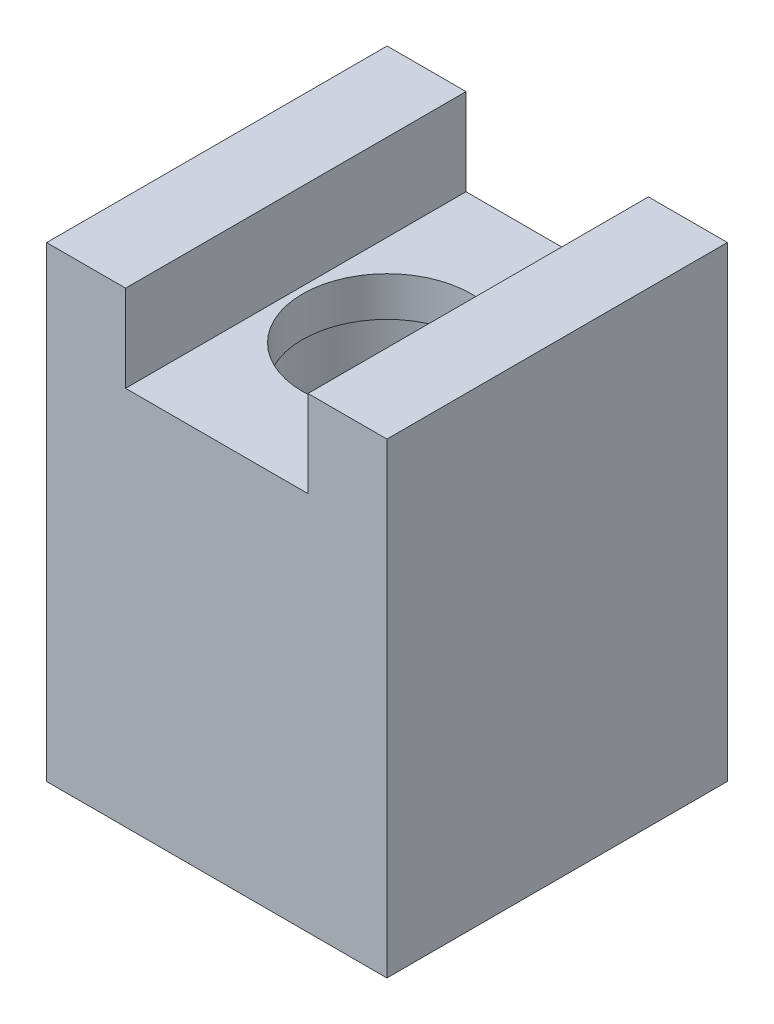
ISO-10303-21;
HEADER;
FILE_DESCRIPTION(('STEP AP214'),'2;1');
FILE_NAME('part.step','',(''),(''),'','','');
FILE_SCHEMA(('AUTOMOTIVE_DESIGN { 1 0 10303 214 1 1 1 1 }'));
ENDSEC;
DATA;
#1=APPLICATION_CONTEXT('core data for automotive mechanical design processes');
#2=APPLICATION_PROTOCOL_DEFINITION('international standard','automotive_design',2000,#1);
#3=PRODUCT_CONTEXT('',#1,'mechanical');
#4=PRODUCT('Part','Part','',(#3));
#5=PRODUCT_RELATED_PRODUCT_CATEGORY('part','',(#4));
#6=PRODUCT_DEFINITION_FORMATION('','',#4);
#7=PRODUCT_DEFINITION_CONTEXT('part definition',#1,'design');
#8=PRODUCT_DEFINITION('design','',#6,#7);
#9=PRODUCT_DEFINITION_SHAPE('','',#8);
#10=(LENGTH_UNIT() NAMED_UNIT(*) SI_UNIT(.MILLI.,.METRE.));
#11=(NAMED_UNIT(*) PLANE_ANGLE_UNIT() SI_UNIT($,.RADIAN.));
#12=(NAMED_UNIT(*) SI_UNIT($,.STERADIAN.) SOLID_ANGLE_UNIT());
#13=UNCERTAINTY_MEASURE_WITH_UNIT(LENGTH_MEASURE(1.E-05),#10,'distance_accuracy_value','');
#14=(GEOMETRIC_REPRESENTATION_CONTEXT(3) GLOBAL_UNCERTAINTY_ASSIGNED_CONTEXT((#13)) GLOBAL_UNIT_ASSIGNED_CONTEXT((#10,
#11,#12)) REPRESENTATION_CONTEXT('',''));
#15=CARTESIAN_POINT('',(0.,0.,0.));
#16=DIRECTION('',(0.,0.,1.));
#17=DIRECTION('',(1.,0.,0.));
#18=AXIS2_PLACEMENT_3D('',#15,#16,#17);
#19=CARTESIAN_POINT('',(0.,36.539424,0.));
#20=DIRECTION('',(0.,-1.,0.));
#21=DIRECTION('',(0.,0.,-1.));
#22=AXIS2_PLACEMENT_3D('',#19,#20,#21);
#23=CYLINDRICAL_SURFACE('',#22,7.5565);
#24=CARTESIAN_POINT('',(0.,33.9852,0.));
#25=DIRECTION('',(0.,-1.,0.));
#26=DIRECTION('',(0.,0.,-1.));
#27=AXIS2_PLACEMENT_3D('',#24,#25,#26);
#28=CIRCLE('',#27,7.5565);
#29=CARTESIAN_POINT('',(0.,33.9852,-7.5565));
#30=VERTEX_POINT('',#29);
#31=EDGE_CURVE('E189',#30,#30,#28,.F.);
#32=ORIENTED_EDGE('',*,*,#31,.T.);
#33=EDGE_LOOP('',(#32));
#34=FACE_BOUND('',#33,.T.);
#35=CARTESIAN_POINT('',(0.,30.44952,0.));
#36=DIRECTION('',(0.,-1.,0.));
#37=DIRECTION('',(0.,0.,-1.));
#38=AXIS2_PLACEMENT_3D('',#35,#36,#37);
#39=CIRCLE('',#38,7.5565);
#40=CARTESIAN_POINT('',(0.,30.44952,-7.5565));
#41=VERTEX_POINT('',#40);
#42=EDGE_CURVE('E36',#41,#41,#39,.F.);
#43=ORIENTED_EDGE('',*,*,#42,.F.);
#44=EDGE_LOOP('',(#43));
#45=FACE_BOUND('',#44,.T.);
#46=ADVANCED_FACE('F32',(#34,#45),#23,.F.);
#47=CARTESIAN_POINT('',(0.,41.74236,0.));
#48=DIRECTION('',(0.,-1.,0.));
#49=DIRECTION('',(0.,0.,-1.));
#50=AXIS2_PLACEMENT_3D('',#47,#48,#49);
#51=PLANE('',#50);
#52=DIRECTION('',(-1.,0.,0.));
#53=VECTOR('',#52,1.);
#54=CARTESIAN_POINT('',(-15.21714,41.74236,-15.22476));
#55=LINE('',#54,#53);
#56=CARTESIAN_POINT('',(15.21714,41.74236,-15.22476));
#57=VERTEX_POINT('',#56);
#58=CARTESIAN_POINT('',(8.15594,41.74236,-15.22476));
#59=VERTEX_POINT('',#58);
#60=EDGE_CURVE('E87',#57,#59,#55,.T.);
#61=ORIENTED_EDGE('',*,*,#60,.T.);
#62=DIRECTION('',(0.,0.,-1.));
#63=VECTOR('',#62,1.);
#64=CARTESIAN_POINT('',(8.15594,41.74236,15.22476));
#65=LINE('',#64,#63);
#66=CARTESIAN_POINT('',(8.15594,41.74236,15.22476));
#67=VERTEX_POINT('',#66);
#68=EDGE_CURVE('E184',#67,#59,#65,.T.);
#69=ORIENTED_EDGE('',*,*,#68,.F.);
#70=DIRECTION('',(1.,0.,0.));
#71=VECTOR('',#70,1.);
#72=CARTESIAN_POINT('',(-15.21714,41.74236,15.22476));
#73=LINE('',#72,#71);
#74=CARTESIAN_POINT('',(15.21714,41.74236,15.22476));
#75=VERTEX_POINT('',#74);
#76=EDGE_CURVE('E58',#67,#75,#73,.T.);
#77=ORIENTED_EDGE('',*,*,#76,.T.);
#78=DIRECTION('',(0.,0.,-1.));
#79=VECTOR('',#78,1.);
#80=CARTESIAN_POINT('',(15.21714,41.74236,15.22476));
#81=LINE('',#80,#79);
#82=EDGE_CURVE('E195',#75,#57,#81,.T.);
#83=ORIENTED_EDGE('',*,*,#82,.T.);
#84=EDGE_LOOP('',(#61,#69,#77,#83));
#85=FACE_BOUND('',#84,.T.);
#86=ADVANCED_FACE('F241',(#85),#51,.F.);
#87=CARTESIAN_POINT('',(15.21714,41.74236,15.22476));
#88=DIRECTION('',(-1.,0.,0.));
#89=DIRECTION('',(0.,0.,1.));
#90=AXIS2_PLACEMENT_3D('',#87,#88,#89);
#91=PLANE('',#90);
#92=DIRECTION('',(0.,0.,-1.));
#93=VECTOR('',#92,1.);
#94=CARTESIAN_POINT('',(15.21714,0.,15.22476));
#95=LINE('',#94,#93);
#96=CARTESIAN_POINT('',(15.21714,0.,15.22476));
#97=VERTEX_POINT('',#96);
#98=CARTESIAN_POINT('',(15.21714,0.,-15.22476));
#99=VERTEX_POINT('',#98);
#100=EDGE_CURVE('E205',#97,#99,#95,.T.);
#101=ORIENTED_EDGE('',*,*,#100,.T.);
#102=DIRECTION('',(0.,-1.,0.));
#103=VECTOR('',#102,1.);
#104=CARTESIAN_POINT('',(15.21714,41.74236,-15.22476));
#105=LINE('',#104,#103);
#106=EDGE_CURVE('E11',#57,#99,#105,.T.);
#107=ORIENTED_EDGE('',*,*,#106,.F.);
#108=ORIENTED_EDGE('',*,*,#82,.F.);
#109=DIRECTION('',(0.,-1.,0.));
#110=VECTOR('',#109,1.);
#111=CARTESIAN_POINT('',(15.21714,41.74236,15.22476));
#112=LINE('',#111,#110);
#113=EDGE_CURVE('E204',#75,#97,#112,.T.);
#114=ORIENTED_EDGE('',*,*,#113,.T.);
#115=EDGE_LOOP('',(#101,#107,#108,#114));
#116=FACE_BOUND('',#115,.T.);
#117=ADVANCED_FACE('F34',(#116),#91,.F.);
#118=CARTESIAN_POINT('',(-15.21714,41.74236,-15.22476));
#119=DIRECTION('',(0.,0.,1.));
#120=DIRECTION('',(1.,0.,0.));
#121=AXIS2_PLACEMENT_3D('',#118,#119,#120);
#122=PLANE('',#121);
#123=DIRECTION('',(-1.,0.,0.));
#124=VECTOR('',#123,1.);
#125=CARTESIAN_POINT('',(-8.15594,33.9852,-15.22476));
#126=LINE('',#125,#124);
#127=CARTESIAN_POINT('',(8.15594,33.9852,-15.22476));
#128=VERTEX_POINT('',#127);
#129=CARTESIAN_POINT('',(-8.15594,33.9852,-15.22476));
#130=VERTEX_POINT('',#129);
#131=EDGE_CURVE('E173',#128,#130,#126,.T.);
#132=ORIENTED_EDGE('',*,*,#131,.F.);
#133=DIRECTION('',(0.,1.,0.));
#134=VECTOR('',#133,1.);
#135=CARTESIAN_POINT('',(8.15594,33.9852,-15.22476));
#136=LINE('',#135,#134);
#137=EDGE_CURVE('E183',#128,#59,#136,.T.);
#138=ORIENTED_EDGE('',*,*,#137,.T.);
#139=ORIENTED_EDGE('',*,*,#60,.F.);
#140=ORIENTED_EDGE('',*,*,#106,.T.);
#141=DIRECTION('',(-1.,0.,0.));
#142=VECTOR('',#141,1.);
#143=CARTESIAN_POINT('',(-15.21714,0.,-15.22476));
#144=LINE('',#143,#142);
#145=CARTESIAN_POINT('',(-15.21714,0.,-15.22476));
#146=VERTEX_POINT('',#145);
#147=EDGE_CURVE('E208',#99,#146,#144,.T.);
#148=ORIENTED_EDGE('',*,*,#147,.T.);
#149=DIRECTION('',(0.,-1.,0.));
#150=VECTOR('',#149,1.);
#151=CARTESIAN_POINT('',(-15.21714,41.74236,-15.22476));
#152=LINE('',#151,#150);
#153=CARTESIAN_POINT('',(-15.21714,41.74236,-15.22476));
#154=VERTEX_POINT('',#153);
#155=EDGE_CURVE('E41',#154,#146,#152,.T.);
#156=ORIENTED_EDGE('',*,*,#155,.F.);
#157=CARTESIAN_POINT('',(-8.15594,41.74236,-15.22476));
#158=VERTEX_POINT('',#157);
#159=EDGE_CURVE('E197',#158,#154,#55,.T.);
#160=ORIENTED_EDGE('',*,*,#159,.F.);
#161=DIRECTION('',(0.,1.,0.));
#162=VECTOR('',#161,1.);
#163=CARTESIAN_POINT('',(-8.15594,33.9852,-15.22476));
#164=LINE('',#163,#162);
#165=EDGE_CURVE('E49',#130,#158,#164,.T.);
#166=ORIENTED_EDGE('',*,*,#165,.F.);
#167=EDGE_LOOP('',(#132,#138,#139,#140,#148,#156,#160,#166));
#168=FACE_BOUND('',#167,.T.);
#169=ADVANCED_FACE('F255',(#168),#122,.F.);
#170=CARTESIAN_POINT('',(-15.21714,41.74236,15.22476));
#171=DIRECTION('',(1.,0.,0.));
#172=DIRECTION('',(0.,0.,-1.));
#173=AXIS2_PLACEMENT_3D('',#170,#171,#172);
#174=PLANE('',#173);
#175=DIRECTION('',(0.,0.,1.));
#176=VECTOR('',#175,1.);
#177=CARTESIAN_POINT('',(-15.21714,0.,15.22476));
#178=LINE('',#177,#176);
#179=CARTESIAN_POINT('',(-15.21714,0.,15.22476));
#180=VERTEX_POINT('',#179);
#181=EDGE_CURVE('E210',#146,#180,#178,.T.);
#182=ORIENTED_EDGE('',*,*,#181,.T.);
#183=DIRECTION('',(0.,-1.,0.));
#184=VECTOR('',#183,1.);
#185=CARTESIAN_POINT('',(-15.21714,41.74236,15.22476));
#186=LINE('',#185,#184);
#187=CARTESIAN_POINT('',(-15.21714,41.74236,15.22476));
#188=VERTEX_POINT('',#187);
#189=EDGE_CURVE('E214',#188,#180,#186,.T.);
#190=ORIENTED_EDGE('',*,*,#189,.F.);
#191=DIRECTION('',(0.,0.,1.));
#192=VECTOR('',#191,1.);
#193=CARTESIAN_POINT('',(-15.21714,41.74236,15.22476));
#194=LINE('',#193,#192);
#195=EDGE_CURVE('E199',#154,#188,#194,.T.);
#196=ORIENTED_EDGE('',*,*,#195,.F.);
#197=ORIENTED_EDGE('',*,*,#155,.T.);
#198=EDGE_LOOP('',(#182,#190,#196,#197));
#199=FACE_BOUND('',#198,.T.);
#200=ADVANCED_FACE('F253',(#199),#174,.F.);
#201=CARTESIAN_POINT('',(-15.21714,41.74236,15.22476));
#202=DIRECTION('',(0.,0.,-1.));
#203=DIRECTION('',(-1.,0.,0.));
#204=AXIS2_PLACEMENT_3D('',#201,#202,#203);
#205=PLANE('',#204);
#206=ORIENTED_EDGE('',*,*,#76,.F.);
#207=DIRECTION('',(0.,1.,0.));
#208=VECTOR('',#207,1.);
#209=CARTESIAN_POINT('',(8.15594,33.9852,15.22476));
#210=LINE('',#209,#208);
#211=CARTESIAN_POINT('',(8.15594,33.9852,15.22476));
#212=VERTEX_POINT('',#211);
#213=EDGE_CURVE('E187',#212,#67,#210,.T.);
#214=ORIENTED_EDGE('',*,*,#213,.F.);
#215=DIRECTION('',(1.,0.,0.));
#216=VECTOR('',#215,1.);
#217=CARTESIAN_POINT('',(-8.15594,33.9852,15.22476));
#218=LINE('',#217,#216);
#219=CARTESIAN_POINT('',(-8.15594,33.9852,15.22476));
#220=VERTEX_POINT('',#219);
#221=EDGE_CURVE('E180',#220,#212,#218,.T.);
#222=ORIENTED_EDGE('',*,*,#221,.F.);
#223=DIRECTION('',(0.,1.,0.));
#224=VECTOR('',#223,1.);
#225=CARTESIAN_POINT('',(-8.15594,33.9852,15.22476));
#226=LINE('',#225,#224);
#227=CARTESIAN_POINT('',(-8.15594,41.74236,15.22476));
#228=VERTEX_POINT('',#227);
#229=EDGE_CURVE('E190',#220,#228,#226,.T.);
#230=ORIENTED_EDGE('',*,*,#229,.T.);
#231=EDGE_CURVE('E201',#188,#228,#73,.T.);
#232=ORIENTED_EDGE('',*,*,#231,.F.);
#233=ORIENTED_EDGE('',*,*,#189,.T.);
#234=DIRECTION('',(1.,0.,0.));
#235=VECTOR('',#234,1.);
#236=CARTESIAN_POINT('',(-15.21714,0.,15.22476));
#237=LINE('',#236,#235);
#238=EDGE_CURVE('E80',#180,#97,#237,.T.);
#239=ORIENTED_EDGE('',*,*,#238,.T.);
#240=ORIENTED_EDGE('',*,*,#113,.F.);
#241=EDGE_LOOP('',(#206,#214,#222,#230,#232,#233,#239,#240));
#242=FACE_BOUND('',#241,.T.);
#243=ADVANCED_FACE('F248',(#242),#205,.F.);
#244=ORIENTED_EDGE('',*,*,#231,.T.);
#245=DIRECTION('',(0.,0.,1.));
#246=VECTOR('',#245,1.);
#247=CARTESIAN_POINT('',(-8.15594,41.74236,15.22476));
#248=LINE('',#247,#246);
#249=EDGE_CURVE('E174',#158,#228,#248,.T.);
#250=ORIENTED_EDGE('',*,*,#249,.F.);
#251=ORIENTED_EDGE('',*,*,#159,.T.);
#252=ORIENTED_EDGE('',*,*,#195,.T.);
#253=EDGE_LOOP('',(#244,#250,#251,#252));
#254=FACE_BOUND('',#253,.T.);
#255=ADVANCED_FACE('F235',(#254),#51,.F.);
#256=CARTESIAN_POINT('',(0.,0.,0.));
#257=DIRECTION('',(0.,-1.,0.));
#258=DIRECTION('',(0.,0.,-1.));
#259=AXIS2_PLACEMENT_3D('',#256,#257,#258);
#260=PLANE('',#259);
#261=CARTESIAN_POINT('',(11.6205,0.,-11.62812));
#262=DIRECTION('',(0.,-1.,0.));
#263=DIRECTION('',(0.,0.,-1.));
#264=AXIS2_PLACEMENT_3D('',#261,#262,#263);
#265=CIRCLE('',#264,1.42875);
#266=CARTESIAN_POINT('',(11.6205,0.,-13.05687));
#267=VERTEX_POINT('',#266);
#268=EDGE_CURVE('E137',#267,#267,#265,.T.);
#269=ORIENTED_EDGE('',*,*,#268,.F.);
#270=EDGE_LOOP('',(#269));
#271=FACE_BOUND('',#270,.T.);
#272=CARTESIAN_POINT('',(-11.6205,0.,-11.62812));
#273=DIRECTION('',(0.,-1.,0.));
#274=DIRECTION('',(0.,0.,-1.));
#275=AXIS2_PLACEMENT_3D('',#272,#273,#274);
#276=CIRCLE('',#275,1.42875);
#277=CARTESIAN_POINT('',(-11.6205,0.,-13.05687));
#278=VERTEX_POINT('',#277);
#279=EDGE_CURVE('E130',#278,#278,#276,.T.);
#280=ORIENTED_EDGE('',*,*,#279,.F.);
#281=EDGE_LOOP('',(#280));
#282=FACE_BOUND('',#281,.T.);
#283=CARTESIAN_POINT('',(-11.6205,0.,11.62812));
#284=DIRECTION('',(0.,-1.,0.));
#285=DIRECTION('',(0.,0.,-1.));
#286=AXIS2_PLACEMENT_3D('',#283,#284,#285);
#287=CIRCLE('',#286,1.42875);
#288=CARTESIAN_POINT('',(-11.6205,0.,10.19937));
#289=VERTEX_POINT('',#288);
#290=EDGE_CURVE('E146',#289,#289,#287,.T.);
#291=ORIENTED_EDGE('',*,*,#290,.F.);
#292=EDGE_LOOP('',(#291));
#293=FACE_BOUND('',#292,.T.);
#294=CARTESIAN_POINT('',(11.6205,0.,11.62812));
#295=DIRECTION('',(0.,-1.,0.));
#296=DIRECTION('',(0.,0.,-1.));
#297=AXIS2_PLACEMENT_3D('',#294,#295,#296);
#298=CIRCLE('',#297,1.42875);
#299=CARTESIAN_POINT('',(11.6205,0.,10.19937));
#300=VERTEX_POINT('',#299);
#301=EDGE_CURVE('E155',#300,#300,#298,.T.);
#302=ORIENTED_EDGE('',*,*,#301,.F.);
#303=EDGE_LOOP('',(#302));
#304=FACE_BOUND('',#303,.T.);
#305=CARTESIAN_POINT('',(0.,0.,0.));
#306=DIRECTION('',(0.,-1.,0.));
#307=DIRECTION('',(0.,0.,-1.));
#308=AXIS2_PLACEMENT_3D('',#305,#306,#307);
#309=CIRCLE('',#308,11.2776);
#310=CARTESIAN_POINT('',(0.,0.,-11.2776));
#311=VERTEX_POINT('',#310);
#312=EDGE_CURVE('E164',#311,#311,#309,.T.);
#313=ORIENTED_EDGE('',*,*,#312,.F.);
#314=EDGE_LOOP('',(#313));
#315=FACE_BOUND('',#314,.T.);
#316=ORIENTED_EDGE('',*,*,#100,.F.);
#317=ORIENTED_EDGE('',*,*,#238,.F.);
#318=ORIENTED_EDGE('',*,*,#181,.F.);
#319=ORIENTED_EDGE('',*,*,#147,.F.);
#320=EDGE_LOOP('',(#316,#317,#318,#319));
#321=FACE_BOUND('',#320,.T.);
#322=ADVANCED_FACE('F225',(#271,#282,#293,#304,#315,#321),#260,.T.);
#323=CARTESIAN_POINT('',(0.,33.9852,0.));
#324=DIRECTION('',(0.,-1.,0.));
#325=DIRECTION('',(0.,0.,-1.));
#326=AXIS2_PLACEMENT_3D('',#323,#324,#325);
#327=PLANE('',#326);
#328=DIRECTION('',(0.,0.,-1.));
#329=VECTOR('',#328,1.);
#330=CARTESIAN_POINT('',(8.15594,33.9852,15.22476));
#331=LINE('',#330,#329);
#332=EDGE_CURVE('E170',#212,#128,#331,.T.);
#333=ORIENTED_EDGE('',*,*,#332,.T.);
#334=ORIENTED_EDGE('',*,*,#131,.T.);
#335=DIRECTION('',(0.,0.,1.));
#336=VECTOR('',#335,1.);
#337=CARTESIAN_POINT('',(-8.15594,33.9852,15.22476));
#338=LINE('',#337,#336);
#339=EDGE_CURVE('E177',#130,#220,#338,.T.);
#340=ORIENTED_EDGE('',*,*,#339,.T.);
#341=ORIENTED_EDGE('',*,*,#221,.T.);
#342=EDGE_LOOP('',(#333,#334,#340,#341));
#343=FACE_BOUND('',#342,.T.);
#344=ORIENTED_EDGE('',*,*,#31,.F.);
#345=EDGE_LOOP('',(#344));
#346=FACE_BOUND('',#345,.T.);
#347=ADVANCED_FACE('F222',(#343,#346),#327,.F.);
#348=CARTESIAN_POINT('',(8.15594,33.9852,15.22476));
#349=DIRECTION('',(1.,0.,0.));
#350=DIRECTION('',(0.,0.,-1.));
#351=AXIS2_PLACEMENT_3D('',#348,#349,#350);
#352=PLANE('',#351);
#353=ORIENTED_EDGE('',*,*,#68,.T.);
#354=ORIENTED_EDGE('',*,*,#137,.F.);
#355=ORIENTED_EDGE('',*,*,#332,.F.);
#356=ORIENTED_EDGE('',*,*,#213,.T.);
#357=EDGE_LOOP('',(#353,#354,#355,#356));
#358=FACE_BOUND('',#357,.T.);
#359=ADVANCED_FACE('F224',(#358),#352,.F.);
#360=CARTESIAN_POINT('',(-8.15594,33.9852,15.22476));
#361=DIRECTION('',(-1.,0.,0.));
#362=DIRECTION('',(0.,0.,1.));
#363=AXIS2_PLACEMENT_3D('',#360,#361,#362);
#364=PLANE('',#363);
#365=ORIENTED_EDGE('',*,*,#249,.T.);
#366=ORIENTED_EDGE('',*,*,#229,.F.);
#367=ORIENTED_EDGE('',*,*,#339,.F.);
#368=ORIENTED_EDGE('',*,*,#165,.T.);
#369=EDGE_LOOP('',(#365,#366,#367,#368));
#370=FACE_BOUND('',#369,.T.);
#371=ADVANCED_FACE('F232',(#370),#364,.F.);
#372=CARTESIAN_POINT('',(0.,30.44952,0.));
#373=DIRECTION('',(0.,-1.,0.));
#374=DIRECTION('',(0.,0.,-1.));
#375=AXIS2_PLACEMENT_3D('',#372,#373,#374);
#376=PLANE('',#375);
#377=CARTESIAN_POINT('',(0.,30.44952,0.));
#378=DIRECTION('',(0.,-1.,0.));
#379=DIRECTION('',(0.,0.,-1.));
#380=AXIS2_PLACEMENT_3D('',#377,#378,#379);
#381=CIRCLE('',#380,11.2776);
#382=CARTESIAN_POINT('',(0.,30.44952,-11.2776));
#383=VERTEX_POINT('',#382);
#384=EDGE_CURVE('E165',#383,#383,#381,.T.);
#385=ORIENTED_EDGE('',*,*,#384,.T.);
#386=EDGE_LOOP('',(#385));
#387=FACE_BOUND('',#386,.T.);
#388=ORIENTED_EDGE('',*,*,#42,.T.);
#389=EDGE_LOOP('',(#388));
#390=FACE_BOUND('',#389,.T.);
#391=ADVANCED_FACE('F276',(#387,#390),#376,.T.);
#392=CARTESIAN_POINT('',(0.,30.44952,0.));
#393=DIRECTION('',(0.,-1.,0.));
#394=DIRECTION('',(0.,0.,-1.));
#395=AXIS2_PLACEMENT_3D('',#392,#393,#394);
#396=CYLINDRICAL_SURFACE('',#395,11.2776);
#397=ORIENTED_EDGE('',*,*,#384,.F.);
#398=EDGE_LOOP('',(#397));
#399=FACE_BOUND('',#398,.T.);
#400=ORIENTED_EDGE('',*,*,#312,.T.);
#401=EDGE_LOOP('',(#400));
#402=FACE_BOUND('',#401,.T.);
#403=ADVANCED_FACE('F280',(#399,#402),#396,.F.);
#404=CARTESIAN_POINT('',(11.6205,12.7,11.62812));
#405=DIRECTION('',(0.,-1.,0.));
#406=DIRECTION('',(0.,0.,-1.));
#407=AXIS2_PLACEMENT_3D('',#404,#405,#406);
#408=CONICAL_SURFACE('',#407,0.793749999999987,1.02974425867665);
#409=CARTESIAN_POINT('',(11.6205,13.1769331163531,11.62812));
#410=VERTEX_POINT('',#409);
#411=VERTEX_LOOP('',#410);
#412=FACE_BOUND('',#411,.T.);
#413=CARTESIAN_POINT('',(11.6205,12.7,11.62812));
#414=DIRECTION('',(0.,-1.,0.));
#415=DIRECTION('',(0.,0.,-1.));
#416=AXIS2_PLACEMENT_3D('',#413,#414,#415);
#417=CIRCLE('',#416,0.793749999999987);
#418=CARTESIAN_POINT('',(11.6205,12.7,10.83437));
#419=VERTEX_POINT('',#418);
#420=EDGE_CURVE('E161',#419,#419,#417,.T.);
#421=ORIENTED_EDGE('',*,*,#420,.T.);
#422=EDGE_LOOP('',(#421));
#423=FACE_BOUND('',#422,.T.);
#424=ADVANCED_FACE('F286',(#412,#423),#408,.F.);
#425=CARTESIAN_POINT('',(11.6205,0.,11.62812));
#426=DIRECTION('',(0.,-1.,0.));
#427=DIRECTION('',(0.,0.,-1.));
#428=AXIS2_PLACEMENT_3D('',#425,#426,#427);
#429=CYLINDRICAL_SURFACE('',#428,0.793749999999992);
#430=ORIENTED_EDGE('',*,*,#420,.F.);
#431=EDGE_LOOP('',(#430));
#432=FACE_BOUND('',#431,.T.);
#433=CARTESIAN_POINT('',(11.6205,0.635,11.62812));
#434=DIRECTION('',(0.,-1.,0.));
#435=DIRECTION('',(0.,0.,-1.));
#436=AXIS2_PLACEMENT_3D('',#433,#434,#435);
#437=CIRCLE('',#436,0.793749999999998);
#438=CARTESIAN_POINT('',(11.6205,0.635,10.83437));
#439=VERTEX_POINT('',#438);
#440=EDGE_CURVE('E158',#439,#439,#437,.T.);
#441=ORIENTED_EDGE('',*,*,#440,.T.);
#442=EDGE_LOOP('',(#441));
#443=FACE_BOUND('',#442,.T.);
#444=ADVANCED_FACE('F292',(#432,#443),#429,.F.);
#445=CARTESIAN_POINT('',(11.6205,0.,11.62812));
#446=DIRECTION('',(0.,-1.,0.));
#447=DIRECTION('',(0.,0.,-1.));
#448=AXIS2_PLACEMENT_3D('',#445,#446,#447);
#449=CONICAL_SURFACE('',#448,1.42875,0.785398163397448);
#450=ORIENTED_EDGE('',*,*,#440,.F.);
#451=EDGE_LOOP('',(#450));
#452=FACE_BOUND('',#451,.T.);
#453=ORIENTED_EDGE('',*,*,#301,.T.);
#454=EDGE_LOOP('',(#453));
#455=FACE_BOUND('',#454,.T.);
#456=ADVANCED_FACE('F296',(#452,#455),#449,.F.);
#457=CARTESIAN_POINT('',(-11.6205,12.7,11.62812));
#458=DIRECTION('',(0.,-1.,0.));
#459=DIRECTION('',(0.,0.,-1.));
#460=AXIS2_PLACEMENT_3D('',#457,#458,#459);
#461=CONICAL_SURFACE('',#460,0.793749999999987,1.02974425867665);
#462=CARTESIAN_POINT('',(-11.6205,13.1769331163531,11.62812));
#463=VERTEX_POINT('',#462);
#464=VERTEX_LOOP('',#463);
#465=FACE_BOUND('',#464,.T.);
#466=CARTESIAN_POINT('',(-11.6205,12.7,11.62812));
#467=DIRECTION('',(0.,-1.,0.));
#468=DIRECTION('',(0.,0.,-1.));
#469=AXIS2_PLACEMENT_3D('',#466,#467,#468);
#470=CIRCLE('',#469,0.793749999999987);
#471=CARTESIAN_POINT('',(-11.6205,12.7,10.83437));
#472=VERTEX_POINT('',#471);
#473=EDGE_CURVE('E152',#472,#472,#470,.T.);
#474=ORIENTED_EDGE('',*,*,#473,.T.);
#475=EDGE_LOOP('',(#474));
#476=FACE_BOUND('',#475,.T.);
#477=ADVANCED_FACE('F300',(#465,#476),#461,.F.);
#478=CARTESIAN_POINT('',(-11.6205,0.,11.62812));
#479=DIRECTION('',(0.,-1.,0.));
#480=DIRECTION('',(0.,0.,-1.));
#481=AXIS2_PLACEMENT_3D('',#478,#479,#480);
#482=CYLINDRICAL_SURFACE('',#481,0.793749999999992);
#483=ORIENTED_EDGE('',*,*,#473,.F.);
#484=EDGE_LOOP('',(#483));
#485=FACE_BOUND('',#484,.T.);
#486=CARTESIAN_POINT('',(-11.6205,0.635,11.62812));
#487=DIRECTION('',(0.,-1.,0.));
#488=DIRECTION('',(0.,0.,-1.));
#489=AXIS2_PLACEMENT_3D('',#486,#487,#488);
#490=CIRCLE('',#489,0.793749999999998);
#491=CARTESIAN_POINT('',(-11.6205,0.635,10.83437));
#492=VERTEX_POINT('',#491);
#493=EDGE_CURVE('E149',#492,#492,#490,.T.);
#494=ORIENTED_EDGE('',*,*,#493,.T.);
#495=EDGE_LOOP('',(#494));
#496=FACE_BOUND('',#495,.T.);
#497=ADVANCED_FACE('F304',(#485,#496),#482,.F.);
#498=CARTESIAN_POINT('',(-11.6205,0.,11.62812));
#499=DIRECTION('',(0.,-1.,0.));
#500=DIRECTION('',(0.,0.,-1.));
#501=AXIS2_PLACEMENT_3D('',#498,#499,#500);
#502=CONICAL_SURFACE('',#501,1.42875,0.785398163397448);
#503=ORIENTED_EDGE('',*,*,#493,.F.);
#504=EDGE_LOOP('',(#503));
#505=FACE_BOUND('',#504,.T.);
#506=ORIENTED_EDGE('',*,*,#290,.T.);
#507=EDGE_LOOP('',(#506));
#508=FACE_BOUND('',#507,.T.);
#509=ADVANCED_FACE('F308',(#505,#508),#502,.F.);
#510=CARTESIAN_POINT('',(-11.6205,12.7,-11.62812));
#511=DIRECTION('',(0.,-1.,0.));
#512=DIRECTION('',(0.,0.,-1.));
#513=AXIS2_PLACEMENT_3D('',#510,#511,#512);
#514=CONICAL_SURFACE('',#513,0.793749999999987,1.02974425867665);
#515=CARTESIAN_POINT('',(-11.6205,13.1769331163531,-11.62812));
#516=VERTEX_POINT('',#515);
#517=VERTEX_LOOP('',#516);
#518=FACE_BOUND('',#517,.T.);
#519=CARTESIAN_POINT('',(-11.6205,12.7,-11.62812));
#520=DIRECTION('',(0.,-1.,0.));
#521=DIRECTION('',(0.,0.,-1.));
#522=AXIS2_PLACEMENT_3D('',#519,#520,#521);
#523=CIRCLE('',#522,0.793749999999987);
#524=CARTESIAN_POINT('',(-11.6205,12.7,-12.42187));
#525=VERTEX_POINT('',#524);
#526=EDGE_CURVE('E143',#525,#525,#523,.T.);
#527=ORIENTED_EDGE('',*,*,#526,.T.);
#528=EDGE_LOOP('',(#527));
#529=FACE_BOUND('',#528,.T.);
#530=ADVANCED_FACE('F312',(#518,#529),#514,.F.);
#531=CARTESIAN_POINT('',(-11.6205,0.,-11.62812));
#532=DIRECTION('',(0.,-1.,0.));
#533=DIRECTION('',(0.,0.,-1.));
#534=AXIS2_PLACEMENT_3D('',#531,#532,#533);
#535=CYLINDRICAL_SURFACE('',#534,0.793749999999992);
#536=ORIENTED_EDGE('',*,*,#526,.F.);
#537=EDGE_LOOP('',(#536));
#538=FACE_BOUND('',#537,.T.);
#539=CARTESIAN_POINT('',(-11.6205,0.635,-11.62812));
#540=DIRECTION('',(0.,-1.,0.));
#541=DIRECTION('',(0.,0.,-1.));
#542=AXIS2_PLACEMENT_3D('',#539,#540,#541);
#543=CIRCLE('',#542,0.793749999999998);
#544=CARTESIAN_POINT('',(-11.6205,0.635,-12.42187));
#545=VERTEX_POINT('',#544);
#546=EDGE_CURVE('E134',#545,#545,#543,.T.);
#547=ORIENTED_EDGE('',*,*,#546,.T.);
#548=EDGE_LOOP('',(#547));
#549=FACE_BOUND('',#548,.T.);
#550=ADVANCED_FACE('F316',(#538,#549),#535,.F.);
#551=CARTESIAN_POINT('',(-11.6205,0.,-11.62812));
#552=DIRECTION('',(0.,-1.,0.));
#553=DIRECTION('',(0.,0.,-1.));
#554=AXIS2_PLACEMENT_3D('',#551,#552,#553);
#555=CONICAL_SURFACE('',#554,1.42875,0.785398163397448);
#556=ORIENTED_EDGE('',*,*,#546,.F.);
#557=EDGE_LOOP('',(#556));
#558=FACE_BOUND('',#557,.T.);
#559=ORIENTED_EDGE('',*,*,#279,.T.);
#560=EDGE_LOOP('',(#559));
#561=FACE_BOUND('',#560,.T.);
#562=ADVANCED_FACE('F124',(#558,#561),#555,.F.);
#563=CARTESIAN_POINT('',(11.6205,12.7,-11.62812));
#564=DIRECTION('',(0.,-1.,0.));
#565=DIRECTION('',(0.,0.,-1.));
#566=AXIS2_PLACEMENT_3D('',#563,#564,#565);
#567=CONICAL_SURFACE('',#566,0.793749999999987,1.02974425867665);
#568=CARTESIAN_POINT('',(11.6205,13.1769331163531,-11.62812));
#569=VERTEX_POINT('',#568);
#570=VERTEX_LOOP('',#569);
#571=FACE_BOUND('',#570,.T.);
#572=CARTESIAN_POINT('',(11.6205,12.7,-11.62812));
#573=DIRECTION('',(0.,-1.,0.));
#574=DIRECTION('',(0.,0.,-1.));
#575=AXIS2_PLACEMENT_3D('',#572,#573,#574);
#576=CIRCLE('',#575,0.793749999999987);
#577=CARTESIAN_POINT('',(11.6205,12.7,-12.42187));
#578=VERTEX_POINT('',#577);
#579=EDGE_CURVE('E128',#578,#578,#576,.T.);
#580=ORIENTED_EDGE('',*,*,#579,.T.);
#581=EDGE_LOOP('',(#580));
#582=FACE_BOUND('',#581,.T.);
#583=ADVANCED_FACE('F120',(#571,#582),#567,.F.);
#584=CARTESIAN_POINT('',(11.6205,0.,-11.62812));
#585=DIRECTION('',(0.,-1.,0.));
#586=DIRECTION('',(0.,0.,-1.));
#587=AXIS2_PLACEMENT_3D('',#584,#585,#586);
#588=CYLINDRICAL_SURFACE('',#587,0.793749999999992);
#589=ORIENTED_EDGE('',*,*,#579,.F.);
#590=EDGE_LOOP('',(#589));
#591=FACE_BOUND('',#590,.T.);
#592=CARTESIAN_POINT('',(11.6205,0.635,-11.62812));
#593=DIRECTION('',(0.,-1.,0.));
#594=DIRECTION('',(0.,0.,-1.));
#595=AXIS2_PLACEMENT_3D('',#592,#593,#594);
#596=CIRCLE('',#595,0.793749999999998);
#597=CARTESIAN_POINT('',(11.6205,0.635,-12.42187));
#598=VERTEX_POINT('',#597);
#599=EDGE_CURVE('E131',#598,#598,#596,.T.);
#600=ORIENTED_EDGE('',*,*,#599,.T.);
#601=EDGE_LOOP('',(#600));
#602=FACE_BOUND('',#601,.T.);
#603=ADVANCED_FACE('F123',(#591,#602),#588,.F.);
#604=CARTESIAN_POINT('',(11.6205,0.,-11.62812));
#605=DIRECTION('',(0.,-1.,0.));
#606=DIRECTION('',(0.,0.,-1.));
#607=AXIS2_PLACEMENT_3D('',#604,#605,#606);
#608=CONICAL_SURFACE('',#607,1.42875,0.785398163397448);
#609=ORIENTED_EDGE('',*,*,#599,.F.);
#610=EDGE_LOOP('',(#609));
#611=FACE_BOUND('',#610,.T.);
#612=ORIENTED_EDGE('',*,*,#268,.T.);
#613=EDGE_LOOP('',(#612));
#614=FACE_BOUND('',#613,.T.);
#615=ADVANCED_FACE('F326',(#611,#614),#608,.F.);
#616=CLOSED_SHELL('',(#46,#86,#117,#169,#200,#243,#255,#322,#347,#359,#371,#391,#403,#424,#444,
#456,#477,#497,#509,#530,#550,#562,#583,#603,#615));
#617=MANIFOLD_SOLID_BREP('B2',#616);
#618=ADVANCED_BREP_SHAPE_REPRESENTATION('',(#18,#617),#14);
#619=SHAPE_DEFINITION_REPRESENTATION(#9,#618);
ENDSEC;
END-ISO-10303-21;
